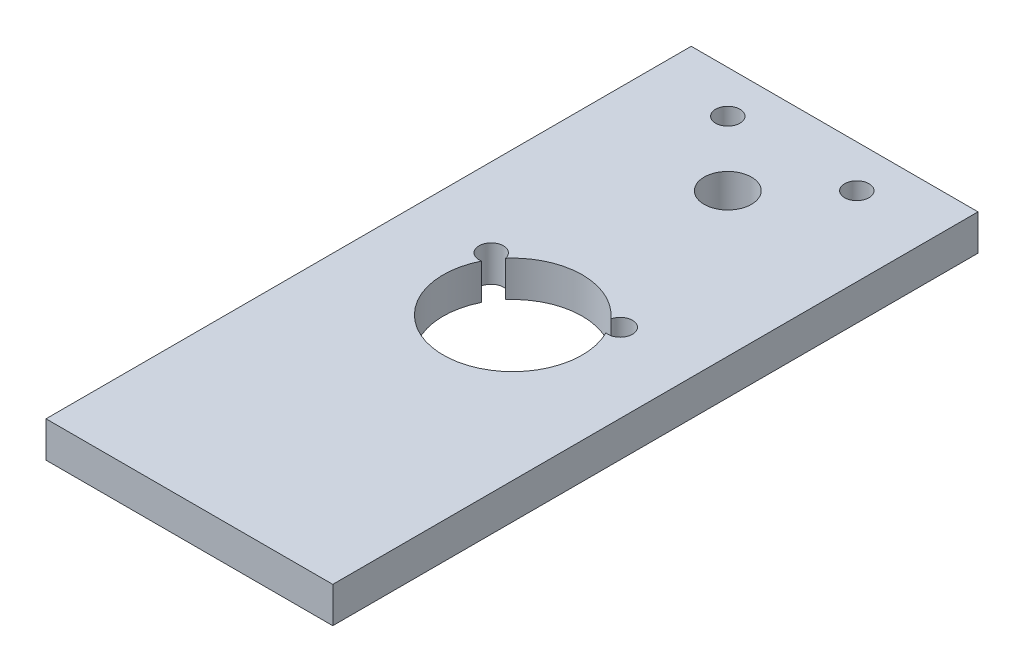
ISO-10303-21;
HEADER;
FILE_DESCRIPTION(('STEP AP214'),'2;1');
FILE_NAME('part.step','',(''),(''),'','','');
FILE_SCHEMA(('AUTOMOTIVE_DESIGN { 1 0 10303 214 1 1 1 1 }'));
ENDSEC;
DATA;
#1=APPLICATION_CONTEXT('core data for automotive mechanical design processes');
#2=APPLICATION_PROTOCOL_DEFINITION('international standard','automotive_design',2000,#1);
#3=PRODUCT_CONTEXT('',#1,'mechanical');
#4=PRODUCT('Part','Part','',(#3));
#5=PRODUCT_RELATED_PRODUCT_CATEGORY('part','',(#4));
#6=PRODUCT_DEFINITION_FORMATION('','',#4);
#7=PRODUCT_DEFINITION_CONTEXT('part definition',#1,'design');
#8=PRODUCT_DEFINITION('design','',#6,#7);
#9=PRODUCT_DEFINITION_SHAPE('','',#8);
#10=(LENGTH_UNIT() NAMED_UNIT(*) SI_UNIT(.MILLI.,.METRE.));
#11=(NAMED_UNIT(*) PLANE_ANGLE_UNIT() SI_UNIT($,.RADIAN.));
#12=(NAMED_UNIT(*) SI_UNIT($,.STERADIAN.) SOLID_ANGLE_UNIT());
#13=UNCERTAINTY_MEASURE_WITH_UNIT(LENGTH_MEASURE(1.E-05),#10,'distance_accuracy_value','');
#14=(GEOMETRIC_REPRESENTATION_CONTEXT(3) GLOBAL_UNCERTAINTY_ASSIGNED_CONTEXT((#13)) GLOBAL_UNIT_ASSIGNED_CONTEXT((#10,
#11,#12)) REPRESENTATION_CONTEXT('',''));
#15=CARTESIAN_POINT('',(0.,0.,0.));
#16=DIRECTION('',(0.,0.,1.));
#17=DIRECTION('',(1.,0.,0.));
#18=AXIS2_PLACEMENT_3D('',#15,#16,#17);
#19=CARTESIAN_POINT('',(20.,0.,-45.1));
#20=DIRECTION('',(0.,1.,0.));
#21=DIRECTION('',(0.,0.,1.));
#22=AXIS2_PLACEMENT_3D('',#19,#20,#21);
#23=CYLINDRICAL_SURFACE('',#22,9.7);
#24=DIRECTION('',(0.,1.,0.));
#25=VECTOR('',#24,1.);
#26=CARTESIAN_POINT('',(27.3356821640664,2.5,-51.4464767539004));
#27=LINE('',#26,#25);
#28=CARTESIAN_POINT('',(27.3356821640664,5.,-51.4464767539004));
#29=VERTEX_POINT('',#28);
#30=CARTESIAN_POINT('',(27.3356821640664,0.,-51.4464767539004));
#31=VERTEX_POINT('',#30);
#32=EDGE_CURVE('E11',#29,#31,#27,.F.);
#33=ORIENTED_EDGE('',*,*,#32,.F.);
#34=CARTESIAN_POINT('',(20.,5.,-45.1));
#35=DIRECTION('',(0.,1.,0.));
#36=DIRECTION('',(0.,0.,1.));
#37=AXIS2_PLACEMENT_3D('',#34,#35,#36);
#38=CIRCLE('',#37,9.7);
#39=CARTESIAN_POINT('',(12.6643178359336,5.,-51.4464767539004));
#40=VERTEX_POINT('',#39);
#41=EDGE_CURVE('E111',#29,#40,#38,.T.);
#42=ORIENTED_EDGE('',*,*,#41,.T.);
#43=DIRECTION('',(0.,1.,0.));
#44=VECTOR('',#43,1.);
#45=CARTESIAN_POINT('',(12.6643178359336,2.5,-51.4464767539004));
#46=LINE('',#45,#44);
#47=CARTESIAN_POINT('',(12.6643178359336,0.,-51.4464767539004));
#48=VERTEX_POINT('',#47);
#49=EDGE_CURVE('E154',#40,#48,#46,.F.);
#50=ORIENTED_EDGE('',*,*,#49,.T.);
#51=CARTESIAN_POINT('',(20.,0.,-45.1));
#52=DIRECTION('',(0.,1.,0.));
#53=DIRECTION('',(0.,0.,1.));
#54=AXIS2_PLACEMENT_3D('',#51,#52,#53);
#55=CIRCLE('',#54,9.7);
#56=EDGE_CURVE('E54',#31,#48,#55,.T.);
#57=ORIENTED_EDGE('',*,*,#56,.F.);
#58=EDGE_LOOP('',(#33,#42,#50,#57));
#59=FACE_BOUND('',#58,.T.);
#60=ADVANCED_FACE('F33',(#59),#23,.F.);
#61=DIRECTION('',(0.,1.,0.));
#62=VECTOR('',#61,1.);
#63=CARTESIAN_POINT('',(28.6797024513182,2.5,-49.4304463230227));
#64=LINE('',#63,#62);
#65=CARTESIAN_POINT('',(28.6797024513182,0.,-49.4304463230227));
#66=VERTEX_POINT('',#65);
#67=CARTESIAN_POINT('',(28.6797024513182,5.,-49.4304463230227));
#68=VERTEX_POINT('',#67);
#69=EDGE_CURVE('E41',#66,#68,#64,.T.);
#70=ORIENTED_EDGE('',*,*,#69,.F.);
#71=CARTESIAN_POINT('',(11.3202975486818,0.,-49.4304463230227));
#72=VERTEX_POINT('',#71);
#73=EDGE_CURVE('E120',#72,#66,#55,.T.);
#74=ORIENTED_EDGE('',*,*,#73,.F.);
#75=DIRECTION('',(0.,1.,0.));
#76=VECTOR('',#75,1.);
#77=CARTESIAN_POINT('',(11.3202975486818,2.5,-49.4304463230227));
#78=LINE('',#77,#76);
#79=CARTESIAN_POINT('',(11.3202975486818,5.,-49.4304463230227));
#80=VERTEX_POINT('',#79);
#81=EDGE_CURVE('E103',#72,#80,#78,.T.);
#82=ORIENTED_EDGE('',*,*,#81,.T.);
#83=EDGE_CURVE('E110',#80,#68,#38,.T.);
#84=ORIENTED_EDGE('',*,*,#83,.T.);
#85=EDGE_LOOP('',(#70,#74,#82,#84));
#86=FACE_BOUND('',#85,.T.);
#87=ADVANCED_FACE('F114',(#86),#23,.F.);
#88=CARTESIAN_POINT('',(0.,5.,0.));
#89=DIRECTION('',(1.,0.,0.));
#90=DIRECTION('',(0.,0.,-1.));
#91=AXIS2_PLACEMENT_3D('',#88,#89,#90);
#92=PLANE('',#91);
#93=DIRECTION('',(0.,0.,1.));
#94=VECTOR('',#93,1.);
#95=CARTESIAN_POINT('',(0.,0.,0.));
#96=LINE('',#95,#94);
#97=CARTESIAN_POINT('',(0.,0.,-90.));
#98=VERTEX_POINT('',#97);
#99=CARTESIAN_POINT('',(0.,0.,0.));
#100=VERTEX_POINT('',#99);
#101=EDGE_CURVE('E135',#98,#100,#96,.T.);
#102=ORIENTED_EDGE('',*,*,#101,.T.);
#103=DIRECTION('',(0.,-1.,0.));
#104=VECTOR('',#103,1.);
#105=CARTESIAN_POINT('',(0.,5.,0.));
#106=LINE('',#105,#104);
#107=CARTESIAN_POINT('',(0.,5.,0.));
#108=VERTEX_POINT('',#107);
#109=EDGE_CURVE('E151',#108,#100,#106,.T.);
#110=ORIENTED_EDGE('',*,*,#109,.F.);
#111=DIRECTION('',(0.,0.,1.));
#112=VECTOR('',#111,1.);
#113=CARTESIAN_POINT('',(0.,5.,0.));
#114=LINE('',#113,#112);
#115=CARTESIAN_POINT('',(0.,5.,-90.));
#116=VERTEX_POINT('',#115);
#117=EDGE_CURVE('E124',#116,#108,#114,.T.);
#118=ORIENTED_EDGE('',*,*,#117,.F.);
#119=DIRECTION('',(0.,-1.,0.));
#120=VECTOR('',#119,1.);
#121=CARTESIAN_POINT('',(0.,5.,-90.));
#122=LINE('',#121,#120);
#123=EDGE_CURVE('E134',#116,#98,#122,.T.);
#124=ORIENTED_EDGE('',*,*,#123,.T.);
#125=EDGE_LOOP('',(#102,#110,#118,#124));
#126=FACE_BOUND('',#125,.T.);
#127=ADVANCED_FACE('F35',(#126),#92,.F.);
#128=CARTESIAN_POINT('',(0.,5.,0.));
#129=DIRECTION('',(0.,0.,-1.));
#130=DIRECTION('',(-1.,0.,0.));
#131=AXIS2_PLACEMENT_3D('',#128,#129,#130);
#132=PLANE('',#131);
#133=DIRECTION('',(1.,0.,0.));
#134=VECTOR('',#133,1.);
#135=CARTESIAN_POINT('',(0.,0.,0.));
#136=LINE('',#135,#134);
#137=CARTESIAN_POINT('',(40.,0.,0.));
#138=VERTEX_POINT('',#137);
#139=EDGE_CURVE('E138',#100,#138,#136,.T.);
#140=ORIENTED_EDGE('',*,*,#139,.T.);
#141=DIRECTION('',(0.,-1.,0.));
#142=VECTOR('',#141,1.);
#143=CARTESIAN_POINT('',(40.,5.,0.));
#144=LINE('',#143,#142);
#145=CARTESIAN_POINT('',(40.,5.,0.));
#146=VERTEX_POINT('',#145);
#147=EDGE_CURVE('E148',#146,#138,#144,.T.);
#148=ORIENTED_EDGE('',*,*,#147,.F.);
#149=DIRECTION('',(1.,0.,0.));
#150=VECTOR('',#149,1.);
#151=CARTESIAN_POINT('',(0.,5.,0.));
#152=LINE('',#151,#150);
#153=EDGE_CURVE('E127',#108,#146,#152,.T.);
#154=ORIENTED_EDGE('',*,*,#153,.F.);
#155=ORIENTED_EDGE('',*,*,#109,.T.);
#156=EDGE_LOOP('',(#140,#148,#154,#155));
#157=FACE_BOUND('',#156,.T.);
#158=ADVANCED_FACE('F196',(#157),#132,.F.);
#159=CARTESIAN_POINT('',(40.,5.,0.));
#160=DIRECTION('',(-1.,0.,0.));
#161=DIRECTION('',(0.,0.,1.));
#162=AXIS2_PLACEMENT_3D('',#159,#160,#161);
#163=PLANE('',#162);
#164=DIRECTION('',(0.,0.,-1.));
#165=VECTOR('',#164,1.);
#166=CARTESIAN_POINT('',(40.,0.,0.));
#167=LINE('',#166,#165);
#168=CARTESIAN_POINT('',(40.,0.,-90.));
#169=VERTEX_POINT('',#168);
#170=EDGE_CURVE('E140',#138,#169,#167,.T.);
#171=ORIENTED_EDGE('',*,*,#170,.T.);
#172=DIRECTION('',(0.,-1.,0.));
#173=VECTOR('',#172,1.);
#174=CARTESIAN_POINT('',(40.,5.,-90.));
#175=LINE('',#174,#173);
#176=CARTESIAN_POINT('',(40.,5.,-90.));
#177=VERTEX_POINT('',#176);
#178=EDGE_CURVE('E145',#177,#169,#175,.T.);
#179=ORIENTED_EDGE('',*,*,#178,.F.);
#180=DIRECTION('',(0.,0.,-1.));
#181=VECTOR('',#180,1.);
#182=CARTESIAN_POINT('',(40.,5.,0.));
#183=LINE('',#182,#181);
#184=EDGE_CURVE('E130',#146,#177,#183,.T.);
#185=ORIENTED_EDGE('',*,*,#184,.F.);
#186=ORIENTED_EDGE('',*,*,#147,.T.);
#187=EDGE_LOOP('',(#171,#179,#185,#186));
#188=FACE_BOUND('',#187,.T.);
#189=ADVANCED_FACE('F201',(#188),#163,.F.);
#190=CARTESIAN_POINT('',(0.,5.,-90.));
#191=DIRECTION('',(0.,0.,1.));
#192=DIRECTION('',(1.,0.,0.));
#193=AXIS2_PLACEMENT_3D('',#190,#191,#192);
#194=PLANE('',#193);
#195=DIRECTION('',(-1.,0.,0.));
#196=VECTOR('',#195,1.);
#197=CARTESIAN_POINT('',(0.,0.,-90.));
#198=LINE('',#197,#196);
#199=EDGE_CURVE('E128',#169,#98,#198,.T.);
#200=ORIENTED_EDGE('',*,*,#199,.T.);
#201=ORIENTED_EDGE('',*,*,#123,.F.);
#202=DIRECTION('',(-1.,0.,0.));
#203=VECTOR('',#202,1.);
#204=CARTESIAN_POINT('',(0.,5.,-90.));
#205=LINE('',#204,#203);
#206=EDGE_CURVE('E132',#177,#116,#205,.T.);
#207=ORIENTED_EDGE('',*,*,#206,.F.);
#208=ORIENTED_EDGE('',*,*,#178,.T.);
#209=EDGE_LOOP('',(#200,#201,#207,#208));
#210=FACE_BOUND('',#209,.T.);
#211=ADVANCED_FACE('F185',(#210),#194,.F.);
#212=CARTESIAN_POINT('',(0.,5.,0.));
#213=DIRECTION('',(0.,-1.,0.));
#214=DIRECTION('',(0.,0.,-1.));
#215=AXIS2_PLACEMENT_3D('',#212,#213,#214);
#216=PLANE('',#215);
#217=CARTESIAN_POINT('',(29.,5.,-84.1));
#218=DIRECTION('',(0.,-1.,0.));
#219=DIRECTION('',(0.,0.,1.));
#220=AXIS2_PLACEMENT_3D('',#217,#218,#219);
#221=CIRCLE('',#220,1.7);
#222=CARTESIAN_POINT('',(29.,5.,-82.4));
#223=VERTEX_POINT('',#222);
#224=EDGE_CURVE('E168',#223,#223,#221,.T.);
#225=ORIENTED_EDGE('',*,*,#224,.T.);
#226=EDGE_LOOP('',(#225));
#227=FACE_BOUND('',#226,.T.);
#228=CARTESIAN_POINT('',(29.,5.,-51.1));
#229=DIRECTION('',(0.,-1.,0.));
#230=DIRECTION('',(0.,0.,1.));
#231=AXIS2_PLACEMENT_3D('',#228,#229,#230);
#232=CIRCLE('',#231,1.7);
#233=EDGE_CURVE('E97',#29,#68,#232,.T.);
#234=ORIENTED_EDGE('',*,*,#233,.T.);
#235=ORIENTED_EDGE('',*,*,#83,.F.);
#236=CARTESIAN_POINT('',(11.,5.,-51.1));
#237=DIRECTION('',(0.,1.,0.));
#238=DIRECTION('',(0.,0.,1.));
#239=AXIS2_PLACEMENT_3D('',#236,#237,#238);
#240=CIRCLE('',#239,1.7);
#241=EDGE_CURVE('E161',#40,#80,#240,.T.);
#242=ORIENTED_EDGE('',*,*,#241,.F.);
#243=ORIENTED_EDGE('',*,*,#41,.F.);
#244=EDGE_LOOP('',(#234,#235,#242,#243));
#245=FACE_BOUND('',#244,.T.);
#246=CARTESIAN_POINT('',(11.,5.,-84.1));
#247=DIRECTION('',(0.,1.,0.));
#248=DIRECTION('',(0.,0.,1.));
#249=AXIS2_PLACEMENT_3D('',#246,#247,#248);
#250=CIRCLE('',#249,1.7);
#251=CARTESIAN_POINT('',(11.,5.,-82.4));
#252=VERTEX_POINT('',#251);
#253=EDGE_CURVE('E165',#252,#252,#250,.T.);
#254=ORIENTED_EDGE('',*,*,#253,.F.);
#255=EDGE_LOOP('',(#254));
#256=FACE_BOUND('',#255,.T.);
#257=CARTESIAN_POINT('',(20.,5.,-75.1));
#258=DIRECTION('',(0.,1.,0.));
#259=DIRECTION('',(0.,0.,1.));
#260=AXIS2_PLACEMENT_3D('',#257,#258,#259);
#261=CIRCLE('',#260,3.3);
#262=CARTESIAN_POINT('',(20.,5.,-71.8));
#263=VERTEX_POINT('',#262);
#264=EDGE_CURVE('E115',#263,#263,#261,.T.);
#265=ORIENTED_EDGE('',*,*,#264,.F.);
#266=EDGE_LOOP('',(#265));
#267=FACE_BOUND('',#266,.T.);
#268=ORIENTED_EDGE('',*,*,#117,.T.);
#269=ORIENTED_EDGE('',*,*,#153,.T.);
#270=ORIENTED_EDGE('',*,*,#184,.T.);
#271=ORIENTED_EDGE('',*,*,#206,.T.);
#272=EDGE_LOOP('',(#268,#269,#270,#271));
#273=FACE_BOUND('',#272,.T.);
#274=ADVANCED_FACE('F107',(#227,#245,#256,#267,#273),#216,.F.);
#275=CARTESIAN_POINT('',(0.,0.,0.));
#276=DIRECTION('',(0.,-1.,0.));
#277=DIRECTION('',(0.,0.,-1.));
#278=AXIS2_PLACEMENT_3D('',#275,#276,#277);
#279=PLANE('',#278);
#280=CARTESIAN_POINT('',(29.,0.,-84.1));
#281=DIRECTION('',(0.,-1.,0.));
#282=DIRECTION('',(0.,0.,1.));
#283=AXIS2_PLACEMENT_3D('',#280,#281,#282);
#284=CIRCLE('',#283,1.7);
#285=CARTESIAN_POINT('',(29.,0.,-82.4));
#286=VERTEX_POINT('',#285);
#287=EDGE_CURVE('E163',#286,#286,#284,.T.);
#288=ORIENTED_EDGE('',*,*,#287,.F.);
#289=EDGE_LOOP('',(#288));
#290=FACE_BOUND('',#289,.T.);
#291=CARTESIAN_POINT('',(11.,0.,-84.1));
#292=DIRECTION('',(0.,1.,0.));
#293=DIRECTION('',(0.,0.,1.));
#294=AXIS2_PLACEMENT_3D('',#291,#292,#293);
#295=CIRCLE('',#294,1.7);
#296=CARTESIAN_POINT('',(11.,0.,-82.4));
#297=VERTEX_POINT('',#296);
#298=EDGE_CURVE('E237',#297,#297,#295,.T.);
#299=ORIENTED_EDGE('',*,*,#298,.T.);
#300=EDGE_LOOP('',(#299));
#301=FACE_BOUND('',#300,.T.);
#302=ORIENTED_EDGE('',*,*,#73,.T.);
#303=CARTESIAN_POINT('',(29.,0.,-51.1));
#304=DIRECTION('',(0.,-1.,0.));
#305=DIRECTION('',(0.,0.,1.));
#306=AXIS2_PLACEMENT_3D('',#303,#304,#305);
#307=CIRCLE('',#306,1.7);
#308=EDGE_CURVE('E47',#31,#66,#307,.T.);
#309=ORIENTED_EDGE('',*,*,#308,.F.);
#310=ORIENTED_EDGE('',*,*,#56,.T.);
#311=CARTESIAN_POINT('',(11.,0.,-51.1));
#312=DIRECTION('',(0.,1.,0.));
#313=DIRECTION('',(0.,0.,1.));
#314=AXIS2_PLACEMENT_3D('',#311,#312,#313);
#315=CIRCLE('',#314,1.7);
#316=EDGE_CURVE('E162',#48,#72,#315,.T.);
#317=ORIENTED_EDGE('',*,*,#316,.T.);
#318=EDGE_LOOP('',(#302,#309,#310,#317));
#319=FACE_BOUND('',#318,.T.);
#320=CARTESIAN_POINT('',(20.,0.,-75.1));
#321=DIRECTION('',(0.,1.,0.));
#322=DIRECTION('',(0.,0.,1.));
#323=AXIS2_PLACEMENT_3D('',#320,#321,#322);
#324=CIRCLE('',#323,3.3);
#325=CARTESIAN_POINT('',(20.,0.,-71.8));
#326=VERTEX_POINT('',#325);
#327=EDGE_CURVE('E118',#326,#326,#324,.T.);
#328=ORIENTED_EDGE('',*,*,#327,.T.);
#329=EDGE_LOOP('',(#328));
#330=FACE_BOUND('',#329,.T.);
#331=ORIENTED_EDGE('',*,*,#101,.F.);
#332=ORIENTED_EDGE('',*,*,#199,.F.);
#333=ORIENTED_EDGE('',*,*,#170,.F.);
#334=ORIENTED_EDGE('',*,*,#139,.F.);
#335=EDGE_LOOP('',(#331,#332,#333,#334));
#336=FACE_BOUND('',#335,.T.);
#337=ADVANCED_FACE('F174',(#290,#301,#319,#330,#336),#279,.T.);
#338=CARTESIAN_POINT('',(20.,0.,-75.1));
#339=DIRECTION('',(0.,1.,0.));
#340=DIRECTION('',(0.,0.,1.));
#341=AXIS2_PLACEMENT_3D('',#338,#339,#340);
#342=CYLINDRICAL_SURFACE('',#341,3.3);
#343=ORIENTED_EDGE('',*,*,#327,.F.);
#344=EDGE_LOOP('',(#343));
#345=FACE_BOUND('',#344,.T.);
#346=ORIENTED_EDGE('',*,*,#264,.T.);
#347=EDGE_LOOP('',(#346));
#348=FACE_BOUND('',#347,.T.);
#349=ADVANCED_FACE('F177',(#345,#348),#342,.F.);
#350=CARTESIAN_POINT('',(11.,0.,-51.1));
#351=DIRECTION('',(0.,1.,0.));
#352=DIRECTION('',(0.,0.,1.));
#353=AXIS2_PLACEMENT_3D('',#350,#351,#352);
#354=CYLINDRICAL_SURFACE('',#353,1.7);
#355=ORIENTED_EDGE('',*,*,#316,.F.);
#356=ORIENTED_EDGE('',*,*,#49,.F.);
#357=ORIENTED_EDGE('',*,*,#241,.T.);
#358=ORIENTED_EDGE('',*,*,#81,.F.);
#359=EDGE_LOOP('',(#355,#356,#357,#358));
#360=FACE_BOUND('',#359,.T.);
#361=ADVANCED_FACE('F160',(#360),#354,.F.);
#362=CARTESIAN_POINT('',(11.,0.,-84.1));
#363=DIRECTION('',(0.,1.,0.));
#364=DIRECTION('',(0.,0.,1.));
#365=AXIS2_PLACEMENT_3D('',#362,#363,#364);
#366=CYLINDRICAL_SURFACE('',#365,1.7);
#367=ORIENTED_EDGE('',*,*,#298,.F.);
#368=EDGE_LOOP('',(#367));
#369=FACE_BOUND('',#368,.T.);
#370=ORIENTED_EDGE('',*,*,#253,.T.);
#371=EDGE_LOOP('',(#370));
#372=FACE_BOUND('',#371,.T.);
#373=ADVANCED_FACE('F220',(#369,#372),#366,.F.);
#374=CARTESIAN_POINT('',(29.,0.,-51.1));
#375=DIRECTION('',(0.,1.,0.));
#376=DIRECTION('',(0.,0.,1.));
#377=AXIS2_PLACEMENT_3D('',#374,#375,#376);
#378=CYLINDRICAL_SURFACE('',#377,1.7);
#379=ORIENTED_EDGE('',*,*,#32,.T.);
#380=ORIENTED_EDGE('',*,*,#308,.T.);
#381=ORIENTED_EDGE('',*,*,#69,.T.);
#382=ORIENTED_EDGE('',*,*,#233,.F.);
#383=EDGE_LOOP('',(#379,#380,#381,#382));
#384=FACE_BOUND('',#383,.T.);
#385=ADVANCED_FACE('F96',(#384),#378,.F.);
#386=CARTESIAN_POINT('',(29.,0.,-84.1));
#387=DIRECTION('',(0.,1.,0.));
#388=DIRECTION('',(0.,0.,1.));
#389=AXIS2_PLACEMENT_3D('',#386,#387,#388);
#390=CYLINDRICAL_SURFACE('',#389,1.7);
#391=ORIENTED_EDGE('',*,*,#287,.T.);
#392=EDGE_LOOP('',(#391));
#393=FACE_BOUND('',#392,.T.);
#394=ORIENTED_EDGE('',*,*,#224,.F.);
#395=EDGE_LOOP('',(#394));
#396=FACE_BOUND('',#395,.T.);
#397=ADVANCED_FACE('F226',(#393,#396),#390,.F.);
#398=CLOSED_SHELL('',(#60,#87,#127,#158,#189,#211,#274,#337,#349,#361,#373,#385,#397));
#399=MANIFOLD_SOLID_BREP('B2',#398);
#400=ADVANCED_BREP_SHAPE_REPRESENTATION('',(#18,#399),#14);
#401=SHAPE_DEFINITION_REPRESENTATION(#9,#400);
ENDSEC;
END-ISO-10303-21;
